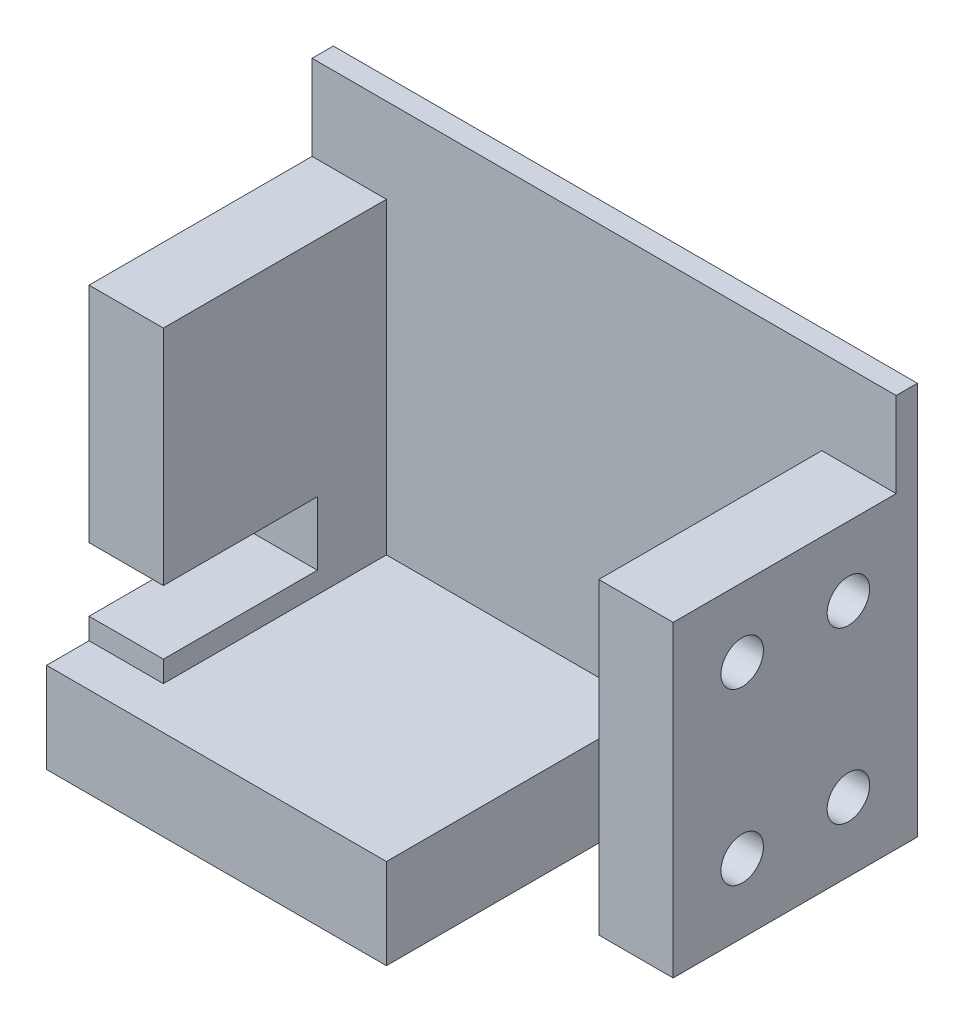
ISO-10303-21;
HEADER;
FILE_DESCRIPTION(('STEP AP214'),'2;1');
FILE_NAME('part.step','',(''),(''),'','','');
FILE_SCHEMA(('AUTOMOTIVE_DESIGN { 1 0 10303 214 1 1 1 1 }'));
ENDSEC;
DATA;
#1=APPLICATION_CONTEXT('core data for automotive mechanical design processes');
#2=APPLICATION_PROTOCOL_DEFINITION('international standard','automotive_design',2000,#1);
#3=PRODUCT_CONTEXT('',#1,'mechanical');
#4=PRODUCT('Part','Part','',(#3));
#5=PRODUCT_RELATED_PRODUCT_CATEGORY('part','',(#4));
#6=PRODUCT_DEFINITION_FORMATION('','',#4);
#7=PRODUCT_DEFINITION_CONTEXT('part definition',#1,'design');
#8=PRODUCT_DEFINITION('design','',#6,#7);
#9=PRODUCT_DEFINITION_SHAPE('','',#8);
#10=(LENGTH_UNIT() NAMED_UNIT(*) SI_UNIT(.MILLI.,.METRE.));
#11=(NAMED_UNIT(*) PLANE_ANGLE_UNIT() SI_UNIT($,.RADIAN.));
#12=(NAMED_UNIT(*) SI_UNIT($,.STERADIAN.) SOLID_ANGLE_UNIT());
#13=UNCERTAINTY_MEASURE_WITH_UNIT(LENGTH_MEASURE(1.E-05),#10,'distance_accuracy_value','');
#14=(GEOMETRIC_REPRESENTATION_CONTEXT(3) GLOBAL_UNCERTAINTY_ASSIGNED_CONTEXT((#13)) GLOBAL_UNIT_ASSIGNED_CONTEXT((#10,
#11,#12)) REPRESENTATION_CONTEXT('',''));
#15=CARTESIAN_POINT('',(0.,0.,0.));
#16=DIRECTION('',(0.,0.,1.));
#17=DIRECTION('',(1.,0.,0.));
#18=AXIS2_PLACEMENT_3D('',#15,#16,#17);
#19=CARTESIAN_POINT('',(13.1687539890637,4.29583237469187,6.5));
#20=DIRECTION('',(1.,0.,0.));
#21=DIRECTION('',(0.,1.,0.));
#22=AXIS2_PLACEMENT_3D('',#19,#20,#21);
#23=CYLINDRICAL_SURFACE('',#22,2.);
#24=CARTESIAN_POINT('',(23.1687539890637,4.29583237469187,6.5));
#25=DIRECTION('',(1.,0.,0.));
#26=DIRECTION('',(0.,1.,0.));
#27=AXIS2_PLACEMENT_3D('',#24,#25,#26);
#28=CIRCLE('',#27,2.);
#29=CARTESIAN_POINT('',(23.1687539890637,6.29583237469187,6.5));
#30=VERTEX_POINT('',#29);
#31=EDGE_CURVE('E231',#30,#30,#28,.T.);
#32=ORIENTED_EDGE('',*,*,#31,.T.);
#33=EDGE_LOOP('',(#32));
#34=FACE_BOUND('',#33,.T.);
#35=CARTESIAN_POINT('',(18.6687539890637,4.29583237469187,6.5));
#36=DIRECTION('',(-1.,0.,0.));
#37=DIRECTION('',(0.,-1.,0.));
#38=AXIS2_PLACEMENT_3D('',#35,#36,#37);
#39=CIRCLE('',#38,2.);
#40=CARTESIAN_POINT('',(18.6687539890637,2.29583237469187,6.5));
#41=VERTEX_POINT('',#40);
#42=EDGE_CURVE('E921',#41,#41,#39,.T.);
#43=ORIENTED_EDGE('',*,*,#42,.T.);
#44=EDGE_LOOP('',(#43));
#45=FACE_BOUND('',#44,.T.);
#46=ADVANCED_FACE('F67',(#34,#45),#23,.F.);
#47=CARTESIAN_POINT('',(13.1687539890637,4.29583237469187,16.5));
#48=DIRECTION('',(1.,0.,0.));
#49=DIRECTION('',(0.,1.,0.));
#50=AXIS2_PLACEMENT_3D('',#47,#48,#49);
#51=CYLINDRICAL_SURFACE('',#50,2.);
#52=CARTESIAN_POINT('',(23.1687539890637,4.29583237469187,16.5));
#53=DIRECTION('',(1.,0.,0.));
#54=DIRECTION('',(0.,1.,0.));
#55=AXIS2_PLACEMENT_3D('',#52,#53,#54);
#56=CIRCLE('',#55,2.);
#57=CARTESIAN_POINT('',(23.1687539890637,6.29583237469187,16.5));
#58=VERTEX_POINT('',#57);
#59=EDGE_CURVE('E897',#58,#58,#56,.F.);
#60=ORIENTED_EDGE('',*,*,#59,.F.);
#61=EDGE_LOOP('',(#60));
#62=FACE_BOUND('',#61,.T.);
#63=CARTESIAN_POINT('',(18.6687539890637,4.29583237469187,16.5));
#64=DIRECTION('',(-1.,0.,0.));
#65=DIRECTION('',(0.,-1.,0.));
#66=AXIS2_PLACEMENT_3D('',#63,#64,#65);
#67=CIRCLE('',#66,2.);
#68=CARTESIAN_POINT('',(18.6687539890637,2.29583237469187,16.5));
#69=VERTEX_POINT('',#68);
#70=EDGE_CURVE('E948',#69,#69,#67,.T.);
#71=ORIENTED_EDGE('',*,*,#70,.T.);
#72=EDGE_LOOP('',(#71));
#73=FACE_BOUND('',#72,.T.);
#74=ADVANCED_FACE('F483',(#62,#73),#51,.F.);
#75=CARTESIAN_POINT('',(13.1687539890637,20.2958323746919,16.5));
#76=DIRECTION('',(1.,0.,0.));
#77=DIRECTION('',(0.,1.,0.));
#78=AXIS2_PLACEMENT_3D('',#75,#76,#77);
#79=CYLINDRICAL_SURFACE('',#78,2.);
#80=CARTESIAN_POINT('',(23.1687539890637,20.2958323746919,16.5));
#81=DIRECTION('',(1.,0.,0.));
#82=DIRECTION('',(0.,1.,0.));
#83=AXIS2_PLACEMENT_3D('',#80,#81,#82);
#84=CIRCLE('',#83,2.);
#85=CARTESIAN_POINT('',(23.1687539890637,22.2958323746919,16.5));
#86=VERTEX_POINT('',#85);
#87=EDGE_CURVE('E901',#86,#86,#84,.T.);
#88=ORIENTED_EDGE('',*,*,#87,.T.);
#89=EDGE_LOOP('',(#88));
#90=FACE_BOUND('',#89,.T.);
#91=CARTESIAN_POINT('',(18.6687539890637,20.2958323746919,16.5));
#92=DIRECTION('',(-1.,0.,0.));
#93=DIRECTION('',(0.,-1.,0.));
#94=AXIS2_PLACEMENT_3D('',#91,#92,#93);
#95=CIRCLE('',#94,2.);
#96=CARTESIAN_POINT('',(18.6687539890637,18.2958323746919,16.5));
#97=VERTEX_POINT('',#96);
#98=EDGE_CURVE('E936',#97,#97,#95,.T.);
#99=ORIENTED_EDGE('',*,*,#98,.T.);
#100=EDGE_LOOP('',(#99));
#101=FACE_BOUND('',#100,.T.);
#102=ADVANCED_FACE('F489',(#90,#101),#79,.F.);
#103=CARTESIAN_POINT('',(13.1687539890637,20.2958323746919,6.5));
#104=DIRECTION('',(1.,0.,0.));
#105=DIRECTION('',(0.,1.,0.));
#106=AXIS2_PLACEMENT_3D('',#103,#104,#105);
#107=CYLINDRICAL_SURFACE('',#106,2.);
#108=CARTESIAN_POINT('',(23.1687539890637,20.2958323746919,6.5));
#109=DIRECTION('',(1.,0.,0.));
#110=DIRECTION('',(0.,1.,0.));
#111=AXIS2_PLACEMENT_3D('',#108,#109,#110);
#112=CIRCLE('',#111,2.);
#113=CARTESIAN_POINT('',(23.1687539890637,22.2958323746919,6.5));
#114=VERTEX_POINT('',#113);
#115=EDGE_CURVE('E905',#114,#114,#112,.F.);
#116=ORIENTED_EDGE('',*,*,#115,.F.);
#117=EDGE_LOOP('',(#116));
#118=FACE_BOUND('',#117,.T.);
#119=CARTESIAN_POINT('',(18.6687539890637,20.2958323746919,6.5));
#120=DIRECTION('',(-1.,0.,0.));
#121=DIRECTION('',(0.,-1.,0.));
#122=AXIS2_PLACEMENT_3D('',#119,#120,#121);
#123=CIRCLE('',#122,2.);
#124=CARTESIAN_POINT('',(18.6687539890637,18.2958323746919,6.5));
#125=VERTEX_POINT('',#124);
#126=EDGE_CURVE('E932',#125,#125,#123,.T.);
#127=ORIENTED_EDGE('',*,*,#126,.T.);
#128=EDGE_LOOP('',(#127));
#129=FACE_BOUND('',#128,.T.);
#130=ADVANCED_FACE('F496',(#118,#129),#107,.F.);
#131=CARTESIAN_POINT('',(23.1687539890637,0.,2.));
#132=DIRECTION('',(1.,0.,0.));
#133=DIRECTION('',(0.,1.,0.));
#134=AXIS2_PLACEMENT_3D('',#131,#132,#133);
#135=PLANE('',#134);
#136=ORIENTED_EDGE('',*,*,#59,.T.);
#137=EDGE_LOOP('',(#136));
#138=FACE_BOUND('',#137,.T.);
#139=ORIENTED_EDGE('',*,*,#31,.F.);
#140=EDGE_LOOP('',(#139));
#141=FACE_BOUND('',#140,.T.);
#142=DIRECTION('',(0.,-1.,0.));
#143=VECTOR('',#142,1.);
#144=CARTESIAN_POINT('',(23.1687539890637,0.,0.));
#145=LINE('',#144,#143);
#146=CARTESIAN_POINT('',(23.1687539890637,34.7958323746919,0.));
#147=VERTEX_POINT('',#146);
#148=CARTESIAN_POINT('',(23.1687539890637,-2.20416762530813,0.));
#149=VERTEX_POINT('',#148);
#150=EDGE_CURVE('E329',#147,#149,#145,.T.);
#151=ORIENTED_EDGE('',*,*,#150,.F.);
#152=DIRECTION('',(0.,0.,-1.));
#153=VECTOR('',#152,1.);
#154=CARTESIAN_POINT('',(23.1687539890637,34.7958323746919,2.));
#155=LINE('',#154,#153);
#156=CARTESIAN_POINT('',(23.1687539890637,34.7958323746919,2.));
#157=VERTEX_POINT('',#156);
#158=EDGE_CURVE('E372',#157,#147,#155,.T.);
#159=ORIENTED_EDGE('',*,*,#158,.F.);
#160=DIRECTION('',(0.,-1.,0.));
#161=VECTOR('',#160,1.);
#162=CARTESIAN_POINT('',(23.1687539890637,0.,2.));
#163=LINE('',#162,#161);
#164=CARTESIAN_POINT('',(23.1687539890637,26.7958323746919,2.));
#165=VERTEX_POINT('',#164);
#166=EDGE_CURVE('E342',#157,#165,#163,.T.);
#167=ORIENTED_EDGE('',*,*,#166,.T.);
#168=DIRECTION('',(0.,0.,-1.));
#169=VECTOR('',#168,1.);
#170=CARTESIAN_POINT('',(23.1687539890637,26.7958323746919,23.));
#171=LINE('',#170,#169);
#172=CARTESIAN_POINT('',(23.1687539890637,26.7958323746919,23.));
#173=VERTEX_POINT('',#172);
#174=EDGE_CURVE('E317',#173,#165,#171,.T.);
#175=ORIENTED_EDGE('',*,*,#174,.F.);
#176=DIRECTION('',(0.,-1.,0.));
#177=VECTOR('',#176,1.);
#178=CARTESIAN_POINT('',(23.1687539890637,0.,23.));
#179=LINE('',#178,#177);
#180=CARTESIAN_POINT('',(23.1687539890637,-2.20416762530813,23.));
#181=VERTEX_POINT('',#180);
#182=EDGE_CURVE('E306',#173,#181,#179,.T.);
#183=ORIENTED_EDGE('',*,*,#182,.T.);
#184=DIRECTION('',(0.,0.,-1.));
#185=VECTOR('',#184,1.);
#186=CARTESIAN_POINT('',(23.1687539890637,-2.20416762530813,23.));
#187=LINE('',#186,#185);
#188=EDGE_CURVE('E321',#181,#149,#187,.T.);
#189=ORIENTED_EDGE('',*,*,#188,.T.);
#190=EDGE_LOOP('',(#151,#159,#167,#175,#183,#189));
#191=FACE_BOUND('',#190,.T.);
#192=ORIENTED_EDGE('',*,*,#87,.F.);
#193=EDGE_LOOP('',(#192));
#194=FACE_BOUND('',#193,.T.);
#195=ORIENTED_EDGE('',*,*,#115,.T.);
#196=EDGE_LOOP('',(#195));
#197=FACE_BOUND('',#196,.T.);
#198=ADVANCED_FACE('F422',(#138,#141,#191,#194,#197),#135,.T.);
#199=CARTESIAN_POINT('',(16.1687539890637,0.,23.));
#200=DIRECTION('',(-1.,0.,0.));
#201=DIRECTION('',(0.,-1.,0.));
#202=AXIS2_PLACEMENT_3D('',#199,#200,#201);
#203=PLANE('',#202);
#204=CARTESIAN_POINT('',(16.1687539890637,20.2958323746919,6.5));
#205=DIRECTION('',(-1.,0.,0.));
#206=DIRECTION('',(0.,-1.,0.));
#207=AXIS2_PLACEMENT_3D('',#204,#205,#206);
#208=CIRCLE('',#207,4.);
#209=CARTESIAN_POINT('',(16.1687539890637,16.2958323746919,6.5));
#210=VERTEX_POINT('',#209);
#211=EDGE_CURVE('E927',#210,#210,#208,.T.);
#212=ORIENTED_EDGE('',*,*,#211,.F.);
#213=EDGE_LOOP('',(#212));
#214=FACE_BOUND('',#213,.T.);
#215=CARTESIAN_POINT('',(16.1687539890637,20.2958323746919,16.5));
#216=DIRECTION('',(-1.,0.,0.));
#217=DIRECTION('',(0.,-1.,0.));
#218=AXIS2_PLACEMENT_3D('',#215,#216,#217);
#219=CIRCLE('',#218,4.);
#220=CARTESIAN_POINT('',(16.1687539890637,16.2958323746919,16.5));
#221=VERTEX_POINT('',#220);
#222=EDGE_CURVE('E940',#221,#221,#219,.T.);
#223=ORIENTED_EDGE('',*,*,#222,.F.);
#224=EDGE_LOOP('',(#223));
#225=FACE_BOUND('',#224,.T.);
#226=CARTESIAN_POINT('',(16.1687539890637,4.29583237469187,16.5));
#227=DIRECTION('',(-1.,0.,0.));
#228=DIRECTION('',(0.,-1.,0.));
#229=AXIS2_PLACEMENT_3D('',#226,#227,#228);
#230=CIRCLE('',#229,4.);
#231=CARTESIAN_POINT('',(16.1687539890637,0.295832374691868,16.5));
#232=VERTEX_POINT('',#231);
#233=EDGE_CURVE('E952',#232,#232,#230,.T.);
#234=ORIENTED_EDGE('',*,*,#233,.F.);
#235=EDGE_LOOP('',(#234));
#236=FACE_BOUND('',#235,.T.);
#237=CARTESIAN_POINT('',(16.1687539890637,4.29583237469187,6.5));
#238=DIRECTION('',(-1.,0.,0.));
#239=DIRECTION('',(0.,-1.,0.));
#240=AXIS2_PLACEMENT_3D('',#237,#238,#239);
#241=CIRCLE('',#240,4.);
#242=CARTESIAN_POINT('',(16.1687539890637,0.295832374691868,6.5));
#243=VERTEX_POINT('',#242);
#244=EDGE_CURVE('E908',#243,#243,#241,.T.);
#245=ORIENTED_EDGE('',*,*,#244,.F.);
#246=EDGE_LOOP('',(#245));
#247=FACE_BOUND('',#246,.T.);
#248=DIRECTION('',(0.,0.,-1.));
#249=VECTOR('',#248,1.);
#250=CARTESIAN_POINT('',(16.1687539890637,26.7958323746919,23.));
#251=LINE('',#250,#249);
#252=CARTESIAN_POINT('',(16.1687539890637,26.7958323746919,23.));
#253=VERTEX_POINT('',#252);
#254=CARTESIAN_POINT('',(16.1687539890637,26.7958323746919,2.));
#255=VERTEX_POINT('',#254);
#256=EDGE_CURVE('E313',#253,#255,#251,.T.);
#257=ORIENTED_EDGE('',*,*,#256,.T.);
#258=DIRECTION('',(0.,1.,0.));
#259=VECTOR('',#258,1.);
#260=CARTESIAN_POINT('',(16.1687539890637,0.,2.));
#261=LINE('',#260,#259);
#262=CARTESIAN_POINT('',(16.1687539890637,-2.20416762530813,2.));
#263=VERTEX_POINT('',#262);
#264=EDGE_CURVE('E334',#263,#255,#261,.T.);
#265=ORIENTED_EDGE('',*,*,#264,.F.);
#266=DIRECTION('',(0.,0.,-1.));
#267=VECTOR('',#266,1.);
#268=CARTESIAN_POINT('',(16.1687539890637,-2.20416762530813,23.));
#269=LINE('',#268,#267);
#270=CARTESIAN_POINT('',(16.1687539890637,-2.20416762530813,23.));
#271=VERTEX_POINT('',#270);
#272=EDGE_CURVE('E325',#271,#263,#269,.T.);
#273=ORIENTED_EDGE('',*,*,#272,.F.);
#274=DIRECTION('',(0.,1.,0.));
#275=VECTOR('',#274,1.);
#276=CARTESIAN_POINT('',(16.1687539890637,0.,23.));
#277=LINE('',#276,#275);
#278=EDGE_CURVE('E299',#271,#253,#277,.T.);
#279=ORIENTED_EDGE('',*,*,#278,.T.);
#280=EDGE_LOOP('',(#257,#265,#273,#279));
#281=FACE_BOUND('',#280,.T.);
#282=ADVANCED_FACE('F432',(#214,#225,#236,#247,#281),#203,.T.);
#283=CARTESIAN_POINT('',(0.,-3.20416762530813,0.));
#284=DIRECTION('',(0.,-1.,0.));
#285=DIRECTION('',(0.,0.,-1.));
#286=AXIS2_PLACEMENT_3D('',#283,#284,#285);
#287=PLANE('',#286);
#288=DIRECTION('',(1.,0.,0.));
#289=VECTOR('',#288,1.);
#290=CARTESIAN_POINT('',(0.,-3.20416762530813,0.));
#291=LINE('',#290,#289);
#292=CARTESIAN_POINT('',(-18.1897412939505,-3.20416762530813,0.));
#293=VERTEX_POINT('',#292);
#294=CARTESIAN_POINT('',(-13.4727507279221,-3.20416762530813,0.));
#295=VERTEX_POINT('',#294);
#296=EDGE_CURVE('E276',#293,#295,#291,.T.);
#297=ORIENTED_EDGE('',*,*,#296,.T.);
#298=CARTESIAN_POINT('',(-15.8312460109363,-3.20416762530813,11.));
#299=DIRECTION('',(0.,-1.,0.));
#300=DIRECTION('',(0.,0.,-1.));
#301=AXIS2_PLACEMENT_3D('',#298,#299,#300);
#302=CIRCLE('',#301,11.25);
#303=EDGE_CURVE('E206',#295,#293,#302,.T.);
#304=ORIENTED_EDGE('',*,*,#303,.T.);
#305=EDGE_LOOP('',(#297,#304));
#306=FACE_BOUND('',#305,.T.);
#307=ADVANCED_FACE('F467',(#306),#287,.T.);
#308=CARTESIAN_POINT('',(0.,0.,23.));
#309=DIRECTION('',(0.,0.,1.));
#310=DIRECTION('',(1.,0.,0.));
#311=AXIS2_PLACEMENT_3D('',#308,#309,#310);
#312=PLANE('',#311);
#313=DIRECTION('',(1.,0.,0.));
#314=VECTOR('',#313,1.);
#315=CARTESIAN_POINT('',(0.,-0.204167625308121,23.));
#316=LINE('',#315,#314);
#317=CARTESIAN_POINT('',(-31.8312460109363,-0.204167625308131,23.));
#318=VERTEX_POINT('',#317);
#319=CARTESIAN_POINT('',(-24.8312460109363,-0.204167625308129,23.));
#320=VERTEX_POINT('',#319);
#321=EDGE_CURVE('E12',#318,#320,#316,.T.);
#322=ORIENTED_EDGE('',*,*,#321,.F.);
#323=DIRECTION('',(0.,-1.,0.));
#324=VECTOR('',#323,1.);
#325=CARTESIAN_POINT('',(-31.8312460109363,0.,23.));
#326=LINE('',#325,#324);
#327=CARTESIAN_POINT('',(-31.8312460109363,-2.20416762530813,23.));
#328=VERTEX_POINT('',#327);
#329=EDGE_CURVE('E390',#318,#328,#326,.T.);
#330=ORIENTED_EDGE('',*,*,#329,.T.);
#331=DIRECTION('',(1.,0.,0.));
#332=VECTOR('',#331,1.);
#333=CARTESIAN_POINT('',(0.,-2.20416762530813,23.));
#334=LINE('',#333,#332);
#335=CARTESIAN_POINT('',(-24.8312460109363,-2.20416762530813,23.));
#336=VERTEX_POINT('',#335);
#337=EDGE_CURVE('E376',#328,#336,#334,.T.);
#338=ORIENTED_EDGE('',*,*,#337,.T.);
#339=DIRECTION('',(0.,1.,0.));
#340=VECTOR('',#339,1.);
#341=CARTESIAN_POINT('',(-24.8312460109363,0.,23.));
#342=LINE('',#341,#340);
#343=EDGE_CURVE('E382',#336,#320,#342,.T.);
#344=ORIENTED_EDGE('',*,*,#343,.T.);
#345=EDGE_LOOP('',(#322,#330,#338,#344));
#346=FACE_BOUND('',#345,.T.);
#347=ADVANCED_FACE('F469',(#346),#312,.T.);
#348=CARTESIAN_POINT('',(0.,-2.20416762530813,23.));
#349=DIRECTION('',(0.,1.,0.));
#350=DIRECTION('',(0.,0.,1.));
#351=AXIS2_PLACEMENT_3D('',#348,#349,#350);
#352=PLANE('',#351);
#353=DIRECTION('',(1.,0.,0.));
#354=VECTOR('',#353,1.);
#355=CARTESIAN_POINT('',(0.,-2.20416762530813,2.));
#356=LINE('',#355,#354);
#357=CARTESIAN_POINT('',(0.168753989063736,-2.20416762530813,2.));
#358=VERTEX_POINT('',#357);
#359=EDGE_CURVE('E335',#358,#263,#356,.T.);
#360=ORIENTED_EDGE('',*,*,#359,.F.);
#361=DIRECTION('',(0.,0.,-1.));
#362=VECTOR('',#361,1.);
#363=CARTESIAN_POINT('',(0.168753989063737,-2.20416762530813,0.));
#364=LINE('',#363,#362);
#365=CARTESIAN_POINT('',(0.168753989063731,-2.20416762530813,0.));
#366=VERTEX_POINT('',#365);
#367=EDGE_CURVE('E285',#358,#366,#364,.T.);
#368=ORIENTED_EDGE('',*,*,#367,.T.);
#369=DIRECTION('',(1.,0.,0.));
#370=VECTOR('',#369,1.);
#371=CARTESIAN_POINT('',(0.,-2.20416762530813,0.));
#372=LINE('',#371,#370);
#373=EDGE_CURVE('E375',#366,#149,#372,.T.);
#374=ORIENTED_EDGE('',*,*,#373,.T.);
#375=ORIENTED_EDGE('',*,*,#188,.F.);
#376=DIRECTION('',(1.,0.,0.));
#377=VECTOR('',#376,1.);
#378=CARTESIAN_POINT('',(0.,-2.20416762530813,23.));
#379=LINE('',#378,#377);
#380=EDGE_CURVE('E303',#271,#181,#379,.T.);
#381=ORIENTED_EDGE('',*,*,#380,.F.);
#382=ORIENTED_EDGE('',*,*,#272,.T.);
#383=EDGE_LOOP('',(#360,#368,#374,#375,#381,#382));
#384=FACE_BOUND('',#383,.T.);
#385=ADVANCED_FACE('F69',(#384),#352,.F.);
#386=CARTESIAN_POINT('',(-24.8312460109363,0.,23.));
#387=DIRECTION('',(-1.,0.,0.));
#388=DIRECTION('',(0.,0.,1.));
#389=AXIS2_PLACEMENT_3D('',#386,#387,#388);
#390=PLANE('',#389);
#391=DIRECTION('',(0.,-1.,0.));
#392=VECTOR('',#391,1.);
#393=CARTESIAN_POINT('',(-24.8312460109363,0.,8.5));
#394=LINE('',#393,#392);
#395=CARTESIAN_POINT('',(-24.8312460109363,5.79583237469187,8.5));
#396=VERTEX_POINT('',#395);
#397=CARTESIAN_POINT('',(-24.8312460109363,-0.20416762530813,8.5));
#398=VERTEX_POINT('',#397);
#399=EDGE_CURVE('E271',#396,#398,#394,.T.);
#400=ORIENTED_EDGE('',*,*,#399,.T.);
#401=DIRECTION('',(0.,0.,1.));
#402=VECTOR('',#401,1.);
#403=CARTESIAN_POINT('',(-24.8312460109363,-0.204167625308129,23.));
#404=LINE('',#403,#402);
#405=EDGE_CURVE('E267',#398,#320,#404,.T.);
#406=ORIENTED_EDGE('',*,*,#405,.T.);
#407=ORIENTED_EDGE('',*,*,#343,.F.);
#408=DIRECTION('',(0.,0.,-1.));
#409=VECTOR('',#408,1.);
#410=CARTESIAN_POINT('',(-24.8312460109363,-2.20416762530813,23.));
#411=LINE('',#410,#409);
#412=CARTESIAN_POINT('',(-24.8312460109363,-2.20416762530813,2.));
#413=VERTEX_POINT('',#412);
#414=EDGE_CURVE('E407',#336,#413,#411,.T.);
#415=ORIENTED_EDGE('',*,*,#414,.T.);
#416=DIRECTION('',(0.,1.,0.));
#417=VECTOR('',#416,1.);
#418=CARTESIAN_POINT('',(-24.8312460109363,0.,2.));
#419=LINE('',#418,#417);
#420=CARTESIAN_POINT('',(-24.8312460109363,26.7958323746919,2.));
#421=VERTEX_POINT('',#420);
#422=EDGE_CURVE('E358',#413,#421,#419,.T.);
#423=ORIENTED_EDGE('',*,*,#422,.T.);
#424=DIRECTION('',(0.,0.,-1.));
#425=VECTOR('',#424,1.);
#426=CARTESIAN_POINT('',(-24.8312460109363,26.7958323746919,23.));
#427=LINE('',#426,#425);
#428=CARTESIAN_POINT('',(-24.8312460109363,26.7958323746919,23.));
#429=VERTEX_POINT('',#428);
#430=EDGE_CURVE('E403',#429,#421,#427,.T.);
#431=ORIENTED_EDGE('',*,*,#430,.F.);
#432=CARTESIAN_POINT('',(-24.8312460109363,5.79583237469187,23.));
#433=VERTEX_POINT('',#432);
#434=EDGE_CURVE('E380',#433,#429,#342,.T.);
#435=ORIENTED_EDGE('',*,*,#434,.F.);
#436=DIRECTION('',(0.,0.,-1.));
#437=VECTOR('',#436,1.);
#438=CARTESIAN_POINT('',(-24.8312460109363,5.79583237469187,23.));
#439=LINE('',#438,#437);
#440=EDGE_CURVE('E91',#433,#396,#439,.T.);
#441=ORIENTED_EDGE('',*,*,#440,.T.);
#442=EDGE_LOOP('',(#400,#406,#407,#415,#423,#431,#435,#441));
#443=FACE_BOUND('',#442,.T.);
#444=ADVANCED_FACE('F454',(#443),#390,.F.);
#445=CARTESIAN_POINT('',(0.,26.7958323746919,23.));
#446=DIRECTION('',(0.,1.,0.));
#447=DIRECTION('',(0.,0.,1.));
#448=AXIS2_PLACEMENT_3D('',#445,#446,#447);
#449=PLANE('',#448);
#450=DIRECTION('',(1.,0.,0.));
#451=VECTOR('',#450,1.);
#452=CARTESIAN_POINT('',(0.,26.7958323746919,2.));
#453=LINE('',#452,#451);
#454=CARTESIAN_POINT('',(-31.8312460109363,26.7958323746919,2.));
#455=VERTEX_POINT('',#454);
#456=EDGE_CURVE('E354',#455,#421,#453,.T.);
#457=ORIENTED_EDGE('',*,*,#456,.F.);
#458=DIRECTION('',(0.,0.,-1.));
#459=VECTOR('',#458,1.);
#460=CARTESIAN_POINT('',(-31.8312460109363,26.7958323746919,23.));
#461=LINE('',#460,#459);
#462=CARTESIAN_POINT('',(-31.8312460109363,26.7958323746919,23.));
#463=VERTEX_POINT('',#462);
#464=EDGE_CURVE('E395',#463,#455,#461,.T.);
#465=ORIENTED_EDGE('',*,*,#464,.F.);
#466=DIRECTION('',(1.,0.,0.));
#467=VECTOR('',#466,1.);
#468=CARTESIAN_POINT('',(0.,26.7958323746919,23.));
#469=LINE('',#468,#467);
#470=EDGE_CURVE('E386',#463,#429,#469,.T.);
#471=ORIENTED_EDGE('',*,*,#470,.T.);
#472=ORIENTED_EDGE('',*,*,#430,.T.);
#473=EDGE_LOOP('',(#457,#465,#471,#472));
#474=FACE_BOUND('',#473,.T.);
#475=ADVANCED_FACE('F449',(#474),#449,.T.);
#476=CARTESIAN_POINT('',(-31.8312460109363,0.,23.));
#477=DIRECTION('',(1.,0.,0.));
#478=DIRECTION('',(0.,0.,-1.));
#479=AXIS2_PLACEMENT_3D('',#476,#477,#478);
#480=PLANE('',#479);
#481=ORIENTED_EDGE('',*,*,#329,.F.);
#482=DIRECTION('',(0.,0.,1.));
#483=VECTOR('',#482,1.);
#484=CARTESIAN_POINT('',(-31.8312460109363,-0.204167625308131,23.));
#485=LINE('',#484,#483);
#486=CARTESIAN_POINT('',(-31.8312460109363,-0.204167625308132,8.5));
#487=VERTEX_POINT('',#486);
#488=EDGE_CURVE('E256',#487,#318,#485,.T.);
#489=ORIENTED_EDGE('',*,*,#488,.F.);
#490=DIRECTION('',(0.,-1.,0.));
#491=VECTOR('',#490,1.);
#492=CARTESIAN_POINT('',(-31.8312460109363,5.79583237469187,8.5));
#493=LINE('',#492,#491);
#494=CARTESIAN_POINT('',(-31.8312460109363,5.79583237469187,8.5));
#495=VERTEX_POINT('',#494);
#496=EDGE_CURVE('E252',#495,#487,#493,.T.);
#497=ORIENTED_EDGE('',*,*,#496,.F.);
#498=DIRECTION('',(0.,0.,-1.));
#499=VECTOR('',#498,1.);
#500=CARTESIAN_POINT('',(-31.8312460109363,5.79583237469187,23.));
#501=LINE('',#500,#499);
#502=CARTESIAN_POINT('',(-31.8312460109363,5.79583237469187,23.));
#503=VERTEX_POINT('',#502);
#504=EDGE_CURVE('E211',#503,#495,#501,.T.);
#505=ORIENTED_EDGE('',*,*,#504,.F.);
#506=EDGE_CURVE('E391',#463,#503,#326,.T.);
#507=ORIENTED_EDGE('',*,*,#506,.F.);
#508=ORIENTED_EDGE('',*,*,#464,.T.);
#509=DIRECTION('',(0.,-1.,0.));
#510=VECTOR('',#509,1.);
#511=CARTESIAN_POINT('',(-31.8312460109363,0.,2.));
#512=LINE('',#511,#510);
#513=CARTESIAN_POINT('',(-31.8312460109363,34.7958323746919,2.));
#514=VERTEX_POINT('',#513);
#515=EDGE_CURVE('E350',#514,#455,#512,.T.);
#516=ORIENTED_EDGE('',*,*,#515,.F.);
#517=DIRECTION('',(0.,0.,-1.));
#518=VECTOR('',#517,1.);
#519=CARTESIAN_POINT('',(-31.8312460109363,34.7958323746919,2.));
#520=LINE('',#519,#518);
#521=CARTESIAN_POINT('',(-31.8312460109363,34.7958323746919,0.));
#522=VERTEX_POINT('',#521);
#523=EDGE_CURVE('E361',#514,#522,#520,.T.);
#524=ORIENTED_EDGE('',*,*,#523,.T.);
#525=DIRECTION('',(0.,-1.,0.));
#526=VECTOR('',#525,1.);
#527=CARTESIAN_POINT('',(-31.8312460109363,0.,0.));
#528=LINE('',#527,#526);
#529=CARTESIAN_POINT('',(-31.8312460109363,-10.7041676253081,0.));
#530=VERTEX_POINT('',#529);
#531=EDGE_CURVE('E381',#522,#530,#528,.T.);
#532=ORIENTED_EDGE('',*,*,#531,.T.);
#533=DIRECTION('',(0.,0.,-1.));
#534=VECTOR('',#533,1.);
#535=CARTESIAN_POINT('',(-31.8312460109363,-10.7041676253081,0.));
#536=LINE('',#535,#534);
#537=CARTESIAN_POINT('',(-31.8312460109363,-10.7041676253081,27.));
#538=VERTEX_POINT('',#537);
#539=EDGE_CURVE('E242',#538,#530,#536,.T.);
#540=ORIENTED_EDGE('',*,*,#539,.F.);
#541=DIRECTION('',(0.,1.,0.));
#542=VECTOR('',#541,1.);
#543=CARTESIAN_POINT('',(-31.8312460109363,-3.20416762530813,27.));
#544=LINE('',#543,#542);
#545=CARTESIAN_POINT('',(-31.8312460109363,-2.20416762530813,27.));
#546=VERTEX_POINT('',#545);
#547=EDGE_CURVE('E279',#538,#546,#544,.T.);
#548=ORIENTED_EDGE('',*,*,#547,.T.);
#549=DIRECTION('',(0.,0.,-1.));
#550=VECTOR('',#549,1.);
#551=CARTESIAN_POINT('',(-31.8312460109363,-2.20416762530813,0.));
#552=LINE('',#551,#550);
#553=EDGE_CURVE('E280',#546,#328,#552,.T.);
#554=ORIENTED_EDGE('',*,*,#553,.T.);
#555=EDGE_LOOP('',(#481,#489,#497,#505,#507,#508,#516,#524,#532,#540,#548,#554));
#556=FACE_BOUND('',#555,.T.);
#557=ADVANCED_FACE('F445',(#556),#480,.F.);
#558=DIRECTION('',(-1.,0.,0.));
#559=VECTOR('',#558,1.);
#560=CARTESIAN_POINT('',(0.,5.79583237469188,23.));
#561=LINE('',#560,#559);
#562=EDGE_CURVE('E76',#433,#503,#561,.T.);
#563=ORIENTED_EDGE('',*,*,#562,.F.);
#564=ORIENTED_EDGE('',*,*,#434,.T.);
#565=ORIENTED_EDGE('',*,*,#470,.F.);
#566=ORIENTED_EDGE('',*,*,#506,.T.);
#567=EDGE_LOOP('',(#563,#564,#565,#566));
#568=FACE_BOUND('',#567,.T.);
#569=ADVANCED_FACE('F477',(#568),#312,.T.);
#570=CARTESIAN_POINT('',(0.,0.,0.));
#571=DIRECTION('',(0.,0.,1.));
#572=DIRECTION('',(1.,0.,0.));
#573=AXIS2_PLACEMENT_3D('',#570,#571,#572);
#574=PLANE('',#573);
#575=ORIENTED_EDGE('',*,*,#373,.F.);
#576=DIRECTION('',(0.,1.,0.));
#577=VECTOR('',#576,1.);
#578=CARTESIAN_POINT('',(0.168753989063733,-3.20416762530813,0.));
#579=LINE('',#578,#577);
#580=CARTESIAN_POINT('',(0.168753989063733,-10.7041676253081,0.));
#581=VERTEX_POINT('',#580);
#582=EDGE_CURVE('E217',#581,#366,#579,.T.);
#583=ORIENTED_EDGE('',*,*,#582,.F.);
#584=DIRECTION('',(1.,0.,0.));
#585=VECTOR('',#584,1.);
#586=CARTESIAN_POINT('',(0.,-10.7041676253081,0.));
#587=LINE('',#586,#585);
#588=CARTESIAN_POINT('',(-13.4727507279221,-10.7041676253081,0.));
#589=VERTEX_POINT('',#588);
#590=EDGE_CURVE('E214',#589,#581,#587,.T.);
#591=ORIENTED_EDGE('',*,*,#590,.F.);
#592=DIRECTION('',(0.,1.,0.));
#593=VECTOR('',#592,1.);
#594=CARTESIAN_POINT('',(-13.4727507279221,-10.7041676253081,0.));
#595=LINE('',#594,#593);
#596=EDGE_CURVE('E201',#589,#295,#595,.T.);
#597=ORIENTED_EDGE('',*,*,#596,.T.);
#598=ORIENTED_EDGE('',*,*,#296,.F.);
#599=DIRECTION('',(0.,1.,0.));
#600=VECTOR('',#599,1.);
#601=CARTESIAN_POINT('',(-18.1897412939505,-10.7041676253081,0.));
#602=LINE('',#601,#600);
#603=CARTESIAN_POINT('',(-18.1897412939505,-10.7041676253081,0.));
#604=VERTEX_POINT('',#603);
#605=EDGE_CURVE('E83',#604,#293,#602,.T.);
#606=ORIENTED_EDGE('',*,*,#605,.F.);
#607=DIRECTION('',(1.,0.,0.));
#608=VECTOR('',#607,1.);
#609=CARTESIAN_POINT('',(0.,-10.7041676253081,0.));
#610=LINE('',#609,#608);
#611=EDGE_CURVE('E227',#530,#604,#610,.T.);
#612=ORIENTED_EDGE('',*,*,#611,.F.);
#613=ORIENTED_EDGE('',*,*,#531,.F.);
#614=DIRECTION('',(1.,0.,0.));
#615=VECTOR('',#614,1.);
#616=CARTESIAN_POINT('',(0.,34.7958323746919,0.));
#617=LINE('',#616,#615);
#618=EDGE_CURVE('E365',#522,#147,#617,.T.);
#619=ORIENTED_EDGE('',*,*,#618,.T.);
#620=ORIENTED_EDGE('',*,*,#150,.T.);
#621=EDGE_LOOP('',(#575,#583,#591,#597,#598,#606,#612,#613,#619,#620));
#622=FACE_BOUND('',#621,.T.);
#623=ADVANCED_FACE('F216',(#622),#574,.F.);
#624=CARTESIAN_POINT('',(0.,34.7958323746919,2.));
#625=DIRECTION('',(0.,1.,0.));
#626=DIRECTION('',(0.,0.,1.));
#627=AXIS2_PLACEMENT_3D('',#624,#625,#626);
#628=PLANE('',#627);
#629=ORIENTED_EDGE('',*,*,#618,.F.);
#630=ORIENTED_EDGE('',*,*,#523,.F.);
#631=DIRECTION('',(1.,0.,0.));
#632=VECTOR('',#631,1.);
#633=CARTESIAN_POINT('',(0.,34.7958323746919,2.));
#634=LINE('',#633,#632);
#635=EDGE_CURVE('E346',#514,#157,#634,.T.);
#636=ORIENTED_EDGE('',*,*,#635,.T.);
#637=ORIENTED_EDGE('',*,*,#158,.T.);
#638=EDGE_LOOP('',(#629,#630,#636,#637));
#639=FACE_BOUND('',#638,.T.);
#640=ADVANCED_FACE('F441',(#639),#628,.T.);
#641=CARTESIAN_POINT('',(0.,0.,2.));
#642=DIRECTION('',(0.,0.,1.));
#643=DIRECTION('',(1.,0.,0.));
#644=AXIS2_PLACEMENT_3D('',#641,#642,#643);
#645=PLANE('',#644);
#646=EDGE_CURVE('E330',#413,#358,#356,.T.);
#647=ORIENTED_EDGE('',*,*,#646,.T.);
#648=ORIENTED_EDGE('',*,*,#359,.T.);
#649=ORIENTED_EDGE('',*,*,#264,.T.);
#650=DIRECTION('',(-1.,0.,0.));
#651=VECTOR('',#650,1.);
#652=CARTESIAN_POINT('',(0.,26.7958323746919,2.));
#653=LINE('',#652,#651);
#654=EDGE_CURVE('E338',#165,#255,#653,.T.);
#655=ORIENTED_EDGE('',*,*,#654,.F.);
#656=ORIENTED_EDGE('',*,*,#166,.F.);
#657=ORIENTED_EDGE('',*,*,#635,.F.);
#658=ORIENTED_EDGE('',*,*,#515,.T.);
#659=ORIENTED_EDGE('',*,*,#456,.T.);
#660=ORIENTED_EDGE('',*,*,#422,.F.);
#661=EDGE_LOOP('',(#647,#648,#649,#655,#656,#657,#658,#659,#660));
#662=FACE_BOUND('',#661,.T.);
#663=ADVANCED_FACE('F435',(#662),#645,.T.);
#664=CARTESIAN_POINT('',(0.,26.7958323746919,23.));
#665=DIRECTION('',(0.,-1.,0.));
#666=DIRECTION('',(1.,0.,0.));
#667=AXIS2_PLACEMENT_3D('',#664,#665,#666);
#668=PLANE('',#667);
#669=ORIENTED_EDGE('',*,*,#654,.T.);
#670=ORIENTED_EDGE('',*,*,#256,.F.);
#671=DIRECTION('',(-1.,0.,0.));
#672=VECTOR('',#671,1.);
#673=CARTESIAN_POINT('',(0.,26.7958323746919,23.));
#674=LINE('',#673,#672);
#675=EDGE_CURVE('E310',#173,#253,#674,.T.);
#676=ORIENTED_EDGE('',*,*,#675,.F.);
#677=ORIENTED_EDGE('',*,*,#174,.T.);
#678=EDGE_LOOP('',(#669,#670,#676,#677));
#679=FACE_BOUND('',#678,.T.);
#680=ADVANCED_FACE('F438',(#679),#668,.F.);
#681=CARTESIAN_POINT('',(0.,0.,23.));
#682=DIRECTION('',(0.,0.,1.));
#683=DIRECTION('',(1.,0.,0.));
#684=AXIS2_PLACEMENT_3D('',#681,#682,#683);
#685=PLANE('',#684);
#686=ORIENTED_EDGE('',*,*,#278,.F.);
#687=ORIENTED_EDGE('',*,*,#380,.T.);
#688=ORIENTED_EDGE('',*,*,#182,.F.);
#689=ORIENTED_EDGE('',*,*,#675,.T.);
#690=EDGE_LOOP('',(#686,#687,#688,#689));
#691=FACE_BOUND('',#690,.T.);
#692=ADVANCED_FACE('F428',(#691),#685,.T.);
#693=CARTESIAN_POINT('',(0.168753989063737,-3.20416762530813,0.));
#694=DIRECTION('',(1.,0.,0.));
#695=DIRECTION('',(0.,0.,-1.));
#696=AXIS2_PLACEMENT_3D('',#693,#694,#695);
#697=PLANE('',#696);
#698=CARTESIAN_POINT('',(0.168753989063729,-2.20416762530813,27.));
#699=VERTEX_POINT('',#698);
#700=EDGE_CURVE('E275',#699,#358,#364,.T.);
#701=ORIENTED_EDGE('',*,*,#700,.F.);
#702=DIRECTION('',(0.,1.,0.));
#703=VECTOR('',#702,1.);
#704=CARTESIAN_POINT('',(0.168753989063729,-3.20416762530813,27.));
#705=LINE('',#704,#703);
#706=CARTESIAN_POINT('',(0.168753989063729,-10.7041676253081,27.));
#707=VERTEX_POINT('',#706);
#708=EDGE_CURVE('E294',#707,#699,#705,.T.);
#709=ORIENTED_EDGE('',*,*,#708,.F.);
#710=DIRECTION('',(0.,0.,-1.));
#711=VECTOR('',#710,1.);
#712=CARTESIAN_POINT('',(0.168753989063737,-10.7041676253081,0.));
#713=LINE('',#712,#711);
#714=EDGE_CURVE('E222',#707,#581,#713,.T.);
#715=ORIENTED_EDGE('',*,*,#714,.T.);
#716=ORIENTED_EDGE('',*,*,#582,.T.);
#717=ORIENTED_EDGE('',*,*,#367,.F.);
#718=EDGE_LOOP('',(#701,#709,#715,#716,#717));
#719=FACE_BOUND('',#718,.T.);
#720=ADVANCED_FACE('F461',(#719),#697,.T.);
#721=CARTESIAN_POINT('',(0.,-3.20416762530813,27.));
#722=DIRECTION('',(0.,0.,1.));
#723=DIRECTION('',(1.,0.,0.));
#724=AXIS2_PLACEMENT_3D('',#721,#722,#723);
#725=PLANE('',#724);
#726=DIRECTION('',(1.,0.,0.));
#727=VECTOR('',#726,1.);
#728=CARTESIAN_POINT('',(0.,-2.20416762530813,27.));
#729=LINE('',#728,#727);
#730=EDGE_CURVE('E284',#546,#699,#729,.T.);
#731=ORIENTED_EDGE('',*,*,#730,.F.);
#732=ORIENTED_EDGE('',*,*,#547,.F.);
#733=DIRECTION('',(1.,0.,0.));
#734=VECTOR('',#733,1.);
#735=CARTESIAN_POINT('',(0.,-10.7041676253081,27.));
#736=LINE('',#735,#734);
#737=EDGE_CURVE('E238',#538,#707,#736,.T.);
#738=ORIENTED_EDGE('',*,*,#737,.T.);
#739=ORIENTED_EDGE('',*,*,#708,.T.);
#740=EDGE_LOOP('',(#731,#732,#738,#739));
#741=FACE_BOUND('',#740,.T.);
#742=ADVANCED_FACE('F464',(#741),#725,.T.);
#743=CARTESIAN_POINT('',(0.,-2.20416762530813,0.));
#744=DIRECTION('',(0.,-1.,0.));
#745=DIRECTION('',(0.,0.,-1.));
#746=AXIS2_PLACEMENT_3D('',#743,#744,#745);
#747=PLANE('',#746);
#748=ORIENTED_EDGE('',*,*,#646,.F.);
#749=ORIENTED_EDGE('',*,*,#414,.F.);
#750=ORIENTED_EDGE('',*,*,#337,.F.);
#751=ORIENTED_EDGE('',*,*,#553,.F.);
#752=ORIENTED_EDGE('',*,*,#730,.T.);
#753=ORIENTED_EDGE('',*,*,#700,.T.);
#754=EDGE_LOOP('',(#748,#749,#750,#751,#752,#753));
#755=FACE_BOUND('',#754,.T.);
#756=ADVANCED_FACE('F458',(#755),#747,.F.);
#757=CARTESIAN_POINT('',(-10.8312460109363,5.79583237469187,8.5));
#758=DIRECTION('',(0.,0.,-1.));
#759=DIRECTION('',(0.,1.,0.));
#760=AXIS2_PLACEMENT_3D('',#757,#758,#759);
#761=PLANE('',#760);
#762=DIRECTION('',(-1.,0.,0.));
#763=VECTOR('',#762,1.);
#764=CARTESIAN_POINT('',(-10.8312460109363,5.79583237469187,8.5));
#765=LINE('',#764,#763);
#766=EDGE_CURVE('E259',#396,#495,#765,.T.);
#767=ORIENTED_EDGE('',*,*,#766,.T.);
#768=ORIENTED_EDGE('',*,*,#496,.T.);
#769=DIRECTION('',(-1.,0.,0.));
#770=VECTOR('',#769,1.);
#771=CARTESIAN_POINT('',(-10.8312460109363,-0.204167625308126,8.5));
#772=LINE('',#771,#770);
#773=EDGE_CURVE('E260',#398,#487,#772,.T.);
#774=ORIENTED_EDGE('',*,*,#773,.F.);
#775=ORIENTED_EDGE('',*,*,#399,.F.);
#776=EDGE_LOOP('',(#767,#768,#774,#775));
#777=FACE_BOUND('',#776,.T.);
#778=ADVANCED_FACE('F507',(#777),#761,.F.);
#779=CARTESIAN_POINT('',(-10.8312460109363,-0.204167625308124,23.));
#780=DIRECTION('',(0.,-1.,0.));
#781=DIRECTION('',(1.,0.,0.));
#782=AXIS2_PLACEMENT_3D('',#779,#780,#781);
#783=PLANE('',#782);
#784=ORIENTED_EDGE('',*,*,#773,.T.);
#785=ORIENTED_EDGE('',*,*,#488,.T.);
#786=ORIENTED_EDGE('',*,*,#321,.T.);
#787=ORIENTED_EDGE('',*,*,#405,.F.);
#788=EDGE_LOOP('',(#784,#785,#786,#787));
#789=FACE_BOUND('',#788,.T.);
#790=ADVANCED_FACE('F504',(#789),#783,.F.);
#791=CARTESIAN_POINT('',(-10.8312460109363,5.79583237469187,23.));
#792=DIRECTION('',(0.,1.,0.));
#793=DIRECTION('',(-1.,0.,0.));
#794=AXIS2_PLACEMENT_3D('',#791,#792,#793);
#795=PLANE('',#794);
#796=ORIENTED_EDGE('',*,*,#562,.T.);
#797=ORIENTED_EDGE('',*,*,#504,.T.);
#798=ORIENTED_EDGE('',*,*,#766,.F.);
#799=ORIENTED_EDGE('',*,*,#440,.F.);
#800=EDGE_LOOP('',(#796,#797,#798,#799));
#801=FACE_BOUND('',#800,.T.);
#802=ADVANCED_FACE('F503',(#801),#795,.F.);
#803=CARTESIAN_POINT('',(-15.8312460109363,-10.7041676253081,11.));
#804=DIRECTION('',(0.,1.,0.));
#805=DIRECTION('',(0.,0.,1.));
#806=AXIS2_PLACEMENT_3D('',#803,#804,#805);
#807=CYLINDRICAL_SURFACE('',#806,11.25);
#808=ORIENTED_EDGE('',*,*,#303,.F.);
#809=ORIENTED_EDGE('',*,*,#596,.F.);
#810=CARTESIAN_POINT('',(-15.8312460109363,-10.7041676253081,11.));
#811=DIRECTION('',(0.,-1.,0.));
#812=DIRECTION('',(0.,0.,-1.));
#813=AXIS2_PLACEMENT_3D('',#810,#811,#812);
#814=CIRCLE('',#813,11.25);
#815=EDGE_CURVE('E205',#589,#604,#814,.T.);
#816=ORIENTED_EDGE('',*,*,#815,.T.);
#817=ORIENTED_EDGE('',*,*,#605,.T.);
#818=EDGE_LOOP('',(#808,#809,#816,#817));
#819=FACE_BOUND('',#818,.T.);
#820=ADVANCED_FACE('F203',(#819),#807,.F.);
#821=CARTESIAN_POINT('',(0.,-10.7041676253081,0.));
#822=DIRECTION('',(0.,-1.,0.));
#823=DIRECTION('',(0.,0.,-1.));
#824=AXIS2_PLACEMENT_3D('',#821,#822,#823);
#825=PLANE('',#824);
#826=ORIENTED_EDGE('',*,*,#815,.F.);
#827=ORIENTED_EDGE('',*,*,#590,.T.);
#828=ORIENTED_EDGE('',*,*,#714,.F.);
#829=ORIENTED_EDGE('',*,*,#737,.F.);
#830=ORIENTED_EDGE('',*,*,#539,.T.);
#831=ORIENTED_EDGE('',*,*,#611,.T.);
#832=EDGE_LOOP('',(#826,#827,#828,#829,#830,#831));
#833=FACE_BOUND('',#832,.T.);
#834=ADVANCED_FACE('F224',(#833),#825,.T.);
#835=CARTESIAN_POINT('',(18.6687539890637,20.2958323746919,6.5));
#836=DIRECTION('',(-1.,0.,0.));
#837=DIRECTION('',(0.,-1.,0.));
#838=AXIS2_PLACEMENT_3D('',#835,#836,#837);
#839=CYLINDRICAL_SURFACE('',#838,4.);
#840=CARTESIAN_POINT('',(18.6687539890637,20.2958323746919,6.5));
#841=DIRECTION('',(-1.,0.,0.));
#842=DIRECTION('',(0.,-1.,0.));
#843=AXIS2_PLACEMENT_3D('',#840,#841,#842);
#844=CIRCLE('',#843,4.);
#845=CARTESIAN_POINT('',(18.6687539890637,16.2958323746919,6.5));
#846=VERTEX_POINT('',#845);
#847=EDGE_CURVE('E931',#846,#846,#844,.T.);
#848=ORIENTED_EDGE('',*,*,#847,.F.);
#849=EDGE_LOOP('',(#848));
#850=FACE_BOUND('',#849,.T.);
#851=ORIENTED_EDGE('',*,*,#211,.T.);
#852=EDGE_LOOP('',(#851));
#853=FACE_BOUND('',#852,.T.);
#854=ADVANCED_FACE('F500',(#850,#853),#839,.F.);
#855=CARTESIAN_POINT('',(18.6687539890637,20.2958323746919,6.5));
#856=DIRECTION('',(-1.,0.,0.));
#857=DIRECTION('',(0.,-1.,0.));
#858=AXIS2_PLACEMENT_3D('',#855,#856,#857);
#859=PLANE('',#858);
#860=ORIENTED_EDGE('',*,*,#126,.F.);
#861=EDGE_LOOP('',(#860));
#862=FACE_BOUND('',#861,.T.);
#863=ORIENTED_EDGE('',*,*,#847,.T.);
#864=EDGE_LOOP('',(#863));
#865=FACE_BOUND('',#864,.T.);
#866=ADVANCED_FACE('F532',(#862,#865),#859,.T.);
#867=CARTESIAN_POINT('',(18.6687539890637,20.2958323746919,16.5));
#868=DIRECTION('',(-1.,0.,0.));
#869=DIRECTION('',(0.,-1.,0.));
#870=AXIS2_PLACEMENT_3D('',#867,#868,#869);
#871=CYLINDRICAL_SURFACE('',#870,4.);
#872=CARTESIAN_POINT('',(18.6687539890637,20.2958323746919,16.5));
#873=DIRECTION('',(-1.,0.,0.));
#874=DIRECTION('',(0.,-1.,0.));
#875=AXIS2_PLACEMENT_3D('',#872,#873,#874);
#876=CIRCLE('',#875,4.);
#877=CARTESIAN_POINT('',(18.6687539890637,16.2958323746919,16.5));
#878=VERTEX_POINT('',#877);
#879=EDGE_CURVE('E944',#878,#878,#876,.T.);
#880=ORIENTED_EDGE('',*,*,#879,.F.);
#881=EDGE_LOOP('',(#880));
#882=FACE_BOUND('',#881,.T.);
#883=ORIENTED_EDGE('',*,*,#222,.T.);
#884=EDGE_LOOP('',(#883));
#885=FACE_BOUND('',#884,.T.);
#886=ADVANCED_FACE('F541',(#882,#885),#871,.F.);
#887=CARTESIAN_POINT('',(18.6687539890637,20.2958323746919,16.5));
#888=DIRECTION('',(-1.,0.,0.));
#889=DIRECTION('',(0.,-1.,0.));
#890=AXIS2_PLACEMENT_3D('',#887,#888,#889);
#891=PLANE('',#890);
#892=ORIENTED_EDGE('',*,*,#98,.F.);
#893=EDGE_LOOP('',(#892));
#894=FACE_BOUND('',#893,.T.);
#895=ORIENTED_EDGE('',*,*,#879,.T.);
#896=EDGE_LOOP('',(#895));
#897=FACE_BOUND('',#896,.T.);
#898=ADVANCED_FACE('F549',(#894,#897),#891,.T.);
#899=CARTESIAN_POINT('',(18.6687539890637,4.29583237469187,16.5));
#900=DIRECTION('',(-1.,0.,0.));
#901=DIRECTION('',(0.,-1.,0.));
#902=AXIS2_PLACEMENT_3D('',#899,#900,#901);
#903=CYLINDRICAL_SURFACE('',#902,4.);
#904=CARTESIAN_POINT('',(18.6687539890637,4.29583237469187,16.5));
#905=DIRECTION('',(-1.,0.,0.));
#906=DIRECTION('',(0.,-1.,0.));
#907=AXIS2_PLACEMENT_3D('',#904,#905,#906);
#908=CIRCLE('',#907,4.);
#909=CARTESIAN_POINT('',(18.6687539890637,0.295832374691868,16.5));
#910=VERTEX_POINT('',#909);
#911=EDGE_CURVE('E926',#910,#910,#908,.T.);
#912=ORIENTED_EDGE('',*,*,#911,.F.);
#913=EDGE_LOOP('',(#912));
#914=FACE_BOUND('',#913,.T.);
#915=ORIENTED_EDGE('',*,*,#233,.T.);
#916=EDGE_LOOP('',(#915));
#917=FACE_BOUND('',#916,.T.);
#918=ADVANCED_FACE('F557',(#914,#917),#903,.F.);
#919=CARTESIAN_POINT('',(18.6687539890637,4.29583237469187,16.5));
#920=DIRECTION('',(-1.,0.,0.));
#921=DIRECTION('',(0.,-1.,0.));
#922=AXIS2_PLACEMENT_3D('',#919,#920,#921);
#923=PLANE('',#922);
#924=ORIENTED_EDGE('',*,*,#70,.F.);
#925=EDGE_LOOP('',(#924));
#926=FACE_BOUND('',#925,.T.);
#927=ORIENTED_EDGE('',*,*,#911,.T.);
#928=EDGE_LOOP('',(#927));
#929=FACE_BOUND('',#928,.T.);
#930=ADVANCED_FACE('F565',(#926,#929),#923,.T.);
#931=CARTESIAN_POINT('',(18.6687539890637,4.29583237469187,6.5));
#932=DIRECTION('',(-1.,0.,0.));
#933=DIRECTION('',(0.,-1.,0.));
#934=AXIS2_PLACEMENT_3D('',#931,#932,#933);
#935=CYLINDRICAL_SURFACE('',#934,4.);
#936=CARTESIAN_POINT('',(18.6687539890637,4.29583237469187,6.5));
#937=DIRECTION('',(-1.,0.,0.));
#938=DIRECTION('',(0.,-1.,0.));
#939=AXIS2_PLACEMENT_3D('',#936,#937,#938);
#940=CIRCLE('',#939,4.);
#941=CARTESIAN_POINT('',(18.6687539890637,0.295832374691868,6.5));
#942=VERTEX_POINT('',#941);
#943=EDGE_CURVE('E912',#942,#942,#940,.T.);
#944=ORIENTED_EDGE('',*,*,#943,.F.);
#945=EDGE_LOOP('',(#944));
#946=FACE_BOUND('',#945,.T.);
#947=ORIENTED_EDGE('',*,*,#244,.T.);
#948=EDGE_LOOP('',(#947));
#949=FACE_BOUND('',#948,.T.);
#950=ADVANCED_FACE('F573',(#946,#949),#935,.F.);
#951=CARTESIAN_POINT('',(18.6687539890637,4.29583237469187,6.5));
#952=DIRECTION('',(-1.,0.,0.));
#953=DIRECTION('',(0.,-1.,0.));
#954=AXIS2_PLACEMENT_3D('',#951,#952,#953);
#955=PLANE('',#954);
#956=ORIENTED_EDGE('',*,*,#42,.F.);
#957=EDGE_LOOP('',(#956));
#958=FACE_BOUND('',#957,.T.);
#959=ORIENTED_EDGE('',*,*,#943,.T.);
#960=EDGE_LOOP('',(#959));
#961=FACE_BOUND('',#960,.T.);
#962=ADVANCED_FACE('F581',(#958,#961),#955,.T.);
#963=CLOSED_SHELL('',(#46,#74,#102,#130,#198,#282,#307,#347,#385,#444,#475,#557,#569,#623,#640,
#663,#680,#692,#720,#742,#756,#778,#790,#802,#820,#834,#854,#866,#886,#898,#918,#930,#950,#962));
#964=MANIFOLD_SOLID_BREP('B2',#963);
#965=ADVANCED_BREP_SHAPE_REPRESENTATION('',(#18,#964),#14);
#966=SHAPE_DEFINITION_REPRESENTATION(#9,#965);
ENDSEC;
END-ISO-10303-21;
